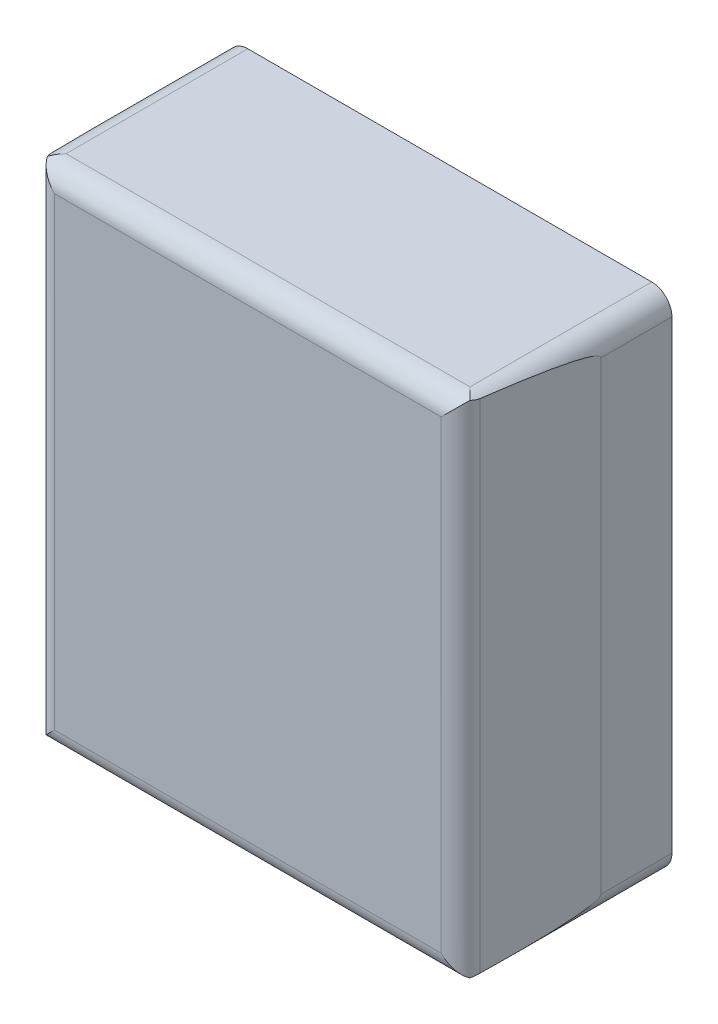
ISO-10303-21;
HEADER;
FILE_DESCRIPTION(('STEP AP214'),'2;1');
FILE_NAME('part.step','',(''),(''),'','','');
FILE_SCHEMA(('AUTOMOTIVE_DESIGN { 1 0 10303 214 1 1 1 1 }'));
ENDSEC;
DATA;
#1=APPLICATION_CONTEXT('core data for automotive mechanical design processes');
#2=APPLICATION_PROTOCOL_DEFINITION('international standard','automotive_design',2000,#1);
#3=PRODUCT_CONTEXT('',#1,'mechanical');
#4=PRODUCT('Part','Part','',(#3));
#5=PRODUCT_RELATED_PRODUCT_CATEGORY('part','',(#4));
#6=PRODUCT_DEFINITION_FORMATION('','',#4);
#7=PRODUCT_DEFINITION_CONTEXT('part definition',#1,'design');
#8=PRODUCT_DEFINITION('design','',#6,#7);
#9=PRODUCT_DEFINITION_SHAPE('','',#8);
#10=(LENGTH_UNIT() NAMED_UNIT(*) SI_UNIT(.MILLI.,.METRE.));
#11=(NAMED_UNIT(*) PLANE_ANGLE_UNIT() SI_UNIT($,.RADIAN.));
#12=(NAMED_UNIT(*) SI_UNIT($,.STERADIAN.) SOLID_ANGLE_UNIT());
#13=UNCERTAINTY_MEASURE_WITH_UNIT(LENGTH_MEASURE(1.E-05),#10,'distance_accuracy_value','');
#14=(GEOMETRIC_REPRESENTATION_CONTEXT(3) GLOBAL_UNCERTAINTY_ASSIGNED_CONTEXT((#13)) GLOBAL_UNIT_ASSIGNED_CONTEXT((#10,
#11,#12)) REPRESENTATION_CONTEXT('',''));
#15=CARTESIAN_POINT('',(0.,0.,0.));
#16=DIRECTION('',(0.,0.,1.));
#17=DIRECTION('',(1.,0.,0.));
#18=AXIS2_PLACEMENT_3D('',#15,#16,#17);
#19=CARTESIAN_POINT('',(0.,0.625,0.78));
#20=DIRECTION('',(0.,1.,0.));
#21=DIRECTION('',(1.,0.,0.));
#22=AXIS2_PLACEMENT_3D('',#19,#20,#21);
#23=PLANE('',#22);
#24=DIRECTION('',(1.,0.,0.));
#25=VECTOR('',#24,1.);
#26=CARTESIAN_POINT('',(0.,0.625,0.28));
#27=LINE('',#26,#25);
#28=CARTESIAN_POINT('',(-0.5,0.625,0.28));
#29=VERTEX_POINT('',#28);
#30=CARTESIAN_POINT('',(0.5,0.625,0.28));
#31=VERTEX_POINT('',#30);
#32=EDGE_CURVE('E41',#29,#31,#27,.T.);
#33=ORIENTED_EDGE('',*,*,#32,.F.);
#34=DIRECTION('',(0.,0.,1.));
#35=VECTOR('',#34,1.);
#36=CARTESIAN_POINT('',(-0.5,0.625,0.455));
#37=LINE('',#36,#35);
#38=CARTESIAN_POINT('',(-0.5,0.625,0.73));
#39=VERTEX_POINT('',#38);
#40=EDGE_CURVE('E11',#29,#39,#37,.T.);
#41=ORIENTED_EDGE('',*,*,#40,.T.);
#42=DIRECTION('',(1.,0.,0.));
#43=VECTOR('',#42,1.);
#44=CARTESIAN_POINT('',(0.,0.625,0.73));
#45=LINE('',#44,#43);
#46=CARTESIAN_POINT('',(0.5,0.625,0.73));
#47=VERTEX_POINT('',#46);
#48=EDGE_CURVE('E28',#39,#47,#45,.T.);
#49=ORIENTED_EDGE('',*,*,#48,.T.);
#50=DIRECTION('',(0.,0.,-1.));
#51=VECTOR('',#50,1.);
#52=CARTESIAN_POINT('',(0.5,0.625,0.78));
#53=LINE('',#52,#51);
#54=EDGE_CURVE('E221',#47,#31,#53,.T.);
#55=ORIENTED_EDGE('',*,*,#54,.T.);
#56=EDGE_LOOP('',(#33,#41,#49,#55));
#57=FACE_BOUND('',#56,.T.);
#58=ADVANCED_FACE('F17',(#57),#23,.T.);
#59=CARTESIAN_POINT('',(-0.55,0.,0.78));
#60=DIRECTION('',(1.,0.,0.));
#61=DIRECTION('',(0.,1.,0.));
#62=AXIS2_PLACEMENT_3D('',#59,#60,#61);
#63=PLANE('',#62);
#64=DIRECTION('',(0.,1.,0.));
#65=VECTOR('',#64,1.);
#66=CARTESIAN_POINT('',(-0.55,0.625,0.455));
#67=LINE('',#66,#65);
#68=CARTESIAN_POINT('',(-0.55,-0.575,0.455));
#69=VERTEX_POINT('',#68);
#70=CARTESIAN_POINT('',(-0.55,0.575,0.455));
#71=VERTEX_POINT('',#70);
#72=EDGE_CURVE('E218',#69,#71,#67,.T.);
#73=ORIENTED_EDGE('',*,*,#72,.T.);
#74=DIRECTION('',(0.,0.,-1.));
#75=VECTOR('',#74,1.);
#76=CARTESIAN_POINT('',(-0.55,0.575,0.28));
#77=LINE('',#76,#75);
#78=CARTESIAN_POINT('',(-0.55,0.575,0.28));
#79=VERTEX_POINT('',#78);
#80=EDGE_CURVE('E222',#71,#79,#77,.T.);
#81=ORIENTED_EDGE('',*,*,#80,.T.);
#82=DIRECTION('',(0.,-1.,0.));
#83=VECTOR('',#82,1.);
#84=CARTESIAN_POINT('',(-0.55,0.,0.28));
#85=LINE('',#84,#83);
#86=CARTESIAN_POINT('',(-0.55,-0.575,0.28));
#87=VERTEX_POINT('',#86);
#88=EDGE_CURVE('E231',#79,#87,#85,.T.);
#89=ORIENTED_EDGE('',*,*,#88,.T.);
#90=DIRECTION('',(0.,0.,1.));
#91=VECTOR('',#90,1.);
#92=CARTESIAN_POINT('',(-0.55,-0.575,0.78));
#93=LINE('',#92,#91);
#94=EDGE_CURVE('E238',#87,#69,#93,.T.);
#95=ORIENTED_EDGE('',*,*,#94,.T.);
#96=EDGE_LOOP('',(#73,#81,#89,#95));
#97=FACE_BOUND('',#96,.T.);
#98=ADVANCED_FACE('F599',(#97),#63,.F.);
#99=CARTESIAN_POINT('',(0.,-0.625,0.78));
#100=DIRECTION('',(0.,1.,0.));
#101=DIRECTION('',(1.,0.,0.));
#102=AXIS2_PLACEMENT_3D('',#99,#100,#101);
#103=PLANE('',#102);
#104=DIRECTION('',(1.,0.,0.));
#105=VECTOR('',#104,1.);
#106=CARTESIAN_POINT('',(0.,-0.625,0.28));
#107=LINE('',#106,#105);
#108=CARTESIAN_POINT('',(-0.5,-0.625,0.28));
#109=VERTEX_POINT('',#108);
#110=CARTESIAN_POINT('',(0.5,-0.625,0.28));
#111=VERTEX_POINT('',#110);
#112=EDGE_CURVE('E341',#109,#111,#107,.T.);
#113=ORIENTED_EDGE('',*,*,#112,.T.);
#114=DIRECTION('',(0.,0.,1.));
#115=VECTOR('',#114,1.);
#116=CARTESIAN_POINT('',(0.5,-0.625,0.455));
#117=LINE('',#116,#115);
#118=CARTESIAN_POINT('',(0.5,-0.625,0.73));
#119=VERTEX_POINT('',#118);
#120=EDGE_CURVE('E337',#111,#119,#117,.T.);
#121=ORIENTED_EDGE('',*,*,#120,.T.);
#122=DIRECTION('',(-1.,0.,0.));
#123=VECTOR('',#122,1.);
#124=CARTESIAN_POINT('',(-0.525,-0.625,0.73));
#125=LINE('',#124,#123);
#126=CARTESIAN_POINT('',(-0.5,-0.625,0.73));
#127=VERTEX_POINT('',#126);
#128=EDGE_CURVE('E213',#119,#127,#125,.T.);
#129=ORIENTED_EDGE('',*,*,#128,.T.);
#130=DIRECTION('',(0.,0.,-1.));
#131=VECTOR('',#130,1.);
#132=CARTESIAN_POINT('',(-0.5,-0.625,0.78));
#133=LINE('',#132,#131);
#134=EDGE_CURVE('E60',#127,#109,#133,.T.);
#135=ORIENTED_EDGE('',*,*,#134,.T.);
#136=EDGE_LOOP('',(#113,#121,#129,#135));
#137=FACE_BOUND('',#136,.T.);
#138=ADVANCED_FACE('F371',(#137),#103,.F.);
#139=CARTESIAN_POINT('',(0.55,0.,0.78));
#140=DIRECTION('',(1.,0.,0.));
#141=DIRECTION('',(0.,1.,0.));
#142=AXIS2_PLACEMENT_3D('',#139,#140,#141);
#143=PLANE('',#142);
#144=DIRECTION('',(0.,-1.,0.));
#145=VECTOR('',#144,1.);
#146=CARTESIAN_POINT('',(0.55,0.,0.28));
#147=LINE('',#146,#145);
#148=CARTESIAN_POINT('',(0.55,0.575,0.28));
#149=VERTEX_POINT('',#148);
#150=CARTESIAN_POINT('',(0.55,-0.575,0.28));
#151=VERTEX_POINT('',#150);
#152=EDGE_CURVE('E251',#149,#151,#147,.T.);
#153=ORIENTED_EDGE('',*,*,#152,.F.);
#154=DIRECTION('',(0.,0.,1.));
#155=VECTOR('',#154,1.);
#156=CARTESIAN_POINT('',(0.55,0.575,0.78));
#157=LINE('',#156,#155);
#158=CARTESIAN_POINT('',(0.55,0.575,0.455));
#159=VERTEX_POINT('',#158);
#160=EDGE_CURVE('E296',#149,#159,#157,.T.);
#161=ORIENTED_EDGE('',*,*,#160,.T.);
#162=DIRECTION('',(0.,-1.,0.));
#163=VECTOR('',#162,1.);
#164=CARTESIAN_POINT('',(0.55,0.,0.455));
#165=LINE('',#164,#163);
#166=CARTESIAN_POINT('',(0.55,-0.575,0.455));
#167=VERTEX_POINT('',#166);
#168=EDGE_CURVE('E292',#159,#167,#165,.T.);
#169=ORIENTED_EDGE('',*,*,#168,.T.);
#170=DIRECTION('',(0.,0.,-1.));
#171=VECTOR('',#170,1.);
#172=CARTESIAN_POINT('',(0.55,-0.575,0.28));
#173=LINE('',#172,#171);
#174=EDGE_CURVE('E244',#167,#151,#173,.T.);
#175=ORIENTED_EDGE('',*,*,#174,.T.);
#176=EDGE_LOOP('',(#153,#161,#169,#175));
#177=FACE_BOUND('',#176,.T.);
#178=ADVANCED_FACE('F374',(#177),#143,.T.);
#179=CARTESIAN_POINT('',(0.,0.,0.78));
#180=DIRECTION('',(0.,0.,1.));
#181=DIRECTION('',(1.,0.,0.));
#182=AXIS2_PLACEMENT_3D('',#179,#180,#181);
#183=PLANE('',#182);
#184=DIRECTION('',(1.,0.,0.));
#185=VECTOR('',#184,1.);
#186=CARTESIAN_POINT('',(0.525,-0.575,0.78));
#187=LINE('',#186,#185);
#188=CARTESIAN_POINT('',(-0.478698443036903,-0.575,0.78));
#189=VERTEX_POINT('',#188);
#190=CARTESIAN_POINT('',(0.478698443036903,-0.575,0.78));
#191=VERTEX_POINT('',#190);
#192=EDGE_CURVE('E241',#189,#191,#187,.T.);
#193=ORIENTED_EDGE('',*,*,#192,.T.);
#194=DIRECTION('',(0.,1.,0.));
#195=VECTOR('',#194,1.);
#196=CARTESIAN_POINT('',(0.478698443036903,0.,0.78));
#197=LINE('',#196,#195);
#198=CARTESIAN_POINT('',(0.478698443036903,0.575,0.78));
#199=VERTEX_POINT('',#198);
#200=EDGE_CURVE('E191',#191,#199,#197,.T.);
#201=ORIENTED_EDGE('',*,*,#200,.T.);
#202=DIRECTION('',(-1.,0.,0.));
#203=VECTOR('',#202,1.);
#204=CARTESIAN_POINT('',(0.,0.575,0.78));
#205=LINE('',#204,#203);
#206=CARTESIAN_POINT('',(-0.478698443036903,0.575,0.78));
#207=VERTEX_POINT('',#206);
#208=EDGE_CURVE('E169',#199,#207,#205,.T.);
#209=ORIENTED_EDGE('',*,*,#208,.T.);
#210=DIRECTION('',(0.,-1.,0.));
#211=VECTOR('',#210,1.);
#212=CARTESIAN_POINT('',(-0.478698443036903,0.,0.78));
#213=LINE('',#212,#211);
#214=EDGE_CURVE('E178',#207,#189,#213,.T.);
#215=ORIENTED_EDGE('',*,*,#214,.T.);
#216=EDGE_LOOP('',(#193,#201,#209,#215));
#217=FACE_BOUND('',#216,.T.);
#218=ADVANCED_FACE('F190',(#217),#183,.T.);
#219=CARTESIAN_POINT('',(0.,0.,0.28));
#220=DIRECTION('',(0.,0.,1.));
#221=DIRECTION('',(1.,0.,0.));
#222=AXIS2_PLACEMENT_3D('',#219,#220,#221);
#223=PLANE('',#222);
#224=ORIENTED_EDGE('',*,*,#88,.F.);
#225=CARTESIAN_POINT('',(-0.5,0.575,0.28));
#226=DIRECTION('',(0.,0.,-1.));
#227=DIRECTION('',(1.,0.,0.));
#228=AXIS2_PLACEMENT_3D('',#225,#226,#227);
#229=CIRCLE('',#228,0.05);
#230=EDGE_CURVE('E188',#79,#29,#229,.T.);
#231=ORIENTED_EDGE('',*,*,#230,.T.);
#232=ORIENTED_EDGE('',*,*,#32,.T.);
#233=CARTESIAN_POINT('',(0.5,0.575,0.28));
#234=DIRECTION('',(0.,0.,-1.));
#235=DIRECTION('',(1.,0.,0.));
#236=AXIS2_PLACEMENT_3D('',#233,#234,#235);
#237=CIRCLE('',#236,0.05);
#238=EDGE_CURVE('E247',#31,#149,#237,.T.);
#239=ORIENTED_EDGE('',*,*,#238,.T.);
#240=ORIENTED_EDGE('',*,*,#152,.T.);
#241=CARTESIAN_POINT('',(0.5,-0.575,0.28));
#242=DIRECTION('',(0.,0.,-1.));
#243=DIRECTION('',(1.,0.,0.));
#244=AXIS2_PLACEMENT_3D('',#241,#242,#243);
#245=CIRCLE('',#244,0.05);
#246=EDGE_CURVE('E281',#151,#111,#245,.T.);
#247=ORIENTED_EDGE('',*,*,#246,.T.);
#248=ORIENTED_EDGE('',*,*,#112,.F.);
#249=CARTESIAN_POINT('',(-0.5,-0.575,0.28));
#250=DIRECTION('',(0.,0.,-1.));
#251=DIRECTION('',(1.,0.,0.));
#252=AXIS2_PLACEMENT_3D('',#249,#250,#251);
#253=CIRCLE('',#252,0.05);
#254=EDGE_CURVE('E285',#109,#87,#253,.T.);
#255=ORIENTED_EDGE('',*,*,#254,.T.);
#256=EDGE_LOOP('',(#224,#231,#232,#239,#240,#247,#248,#255));
#257=FACE_BOUND('',#256,.T.);
#258=ADVANCED_FACE('F19',(#257),#223,.F.);
#259=CARTESIAN_POINT('',(0.55,0.,0.455));
#260=DIRECTION('',(-0.997054485501582,0.,-0.0766964988847369));
#261=DIRECTION('',(-0.0766964988847369,0.,0.997054485501582));
#262=AXIS2_PLACEMENT_3D('',#259,#260,#261);
#263=PLANE('',#262);
#264=ORIENTED_EDGE('',*,*,#168,.F.);
#265=CARTESIAN_POINT('',(0.5,0.575,1.105));
#266=DIRECTION('',(0.997054485501582,0.,0.0766964988847369));
#267=DIRECTION('',(0.0766964988847369,0.,-0.997054485501582));
#268=AXIS2_PLACEMENT_3D('',#265,#266,#267);
#269=ELLIPSE('',#268,0.651920240520266,0.05);
#270=CARTESIAN_POINT('',(0.528551167311982,0.616046691037442,0.733834824944237));
#271=VERTEX_POINT('',#270);
#272=EDGE_CURVE('E217',#159,#271,#269,.T.);
#273=ORIENTED_EDGE('',*,*,#272,.T.);
#274=DIRECTION('',(0.,-1.,0.));
#275=VECTOR('',#274,1.);
#276=CARTESIAN_POINT('',(0.528551167311982,0.,0.733834824944237));
#277=LINE('',#276,#275);
#278=CARTESIAN_POINT('',(0.528551167311982,-0.616046691037442,0.733834824944237));
#279=VERTEX_POINT('',#278);
#280=EDGE_CURVE('E215',#271,#279,#277,.T.);
#281=ORIENTED_EDGE('',*,*,#280,.T.);
#282=CARTESIAN_POINT('',(0.5,-0.575,1.105));
#283=DIRECTION('',(0.997054485501582,0.,0.0766964988847369));
#284=DIRECTION('',(-0.0766964988847369,0.,0.997054485501582));
#285=AXIS2_PLACEMENT_3D('',#282,#283,#284);
#286=ELLIPSE('',#285,0.651920240520266,0.05);
#287=EDGE_CURVE('E21',#279,#167,#286,.T.);
#288=ORIENTED_EDGE('',*,*,#287,.T.);
#289=EDGE_LOOP('',(#264,#273,#281,#288));
#290=FACE_BOUND('',#289,.T.);
#291=ADVANCED_FACE('F376',(#290),#263,.F.);
#292=CARTESIAN_POINT('',(-0.525,0.,0.78));
#293=DIRECTION('',(-0.997054485501582,0.,0.0766964988847369));
#294=DIRECTION('',(0.,1.,0.));
#295=AXIS2_PLACEMENT_3D('',#292,#293,#294);
#296=PLANE('',#295);
#297=DIRECTION('',(0.,1.,0.));
#298=VECTOR('',#297,1.);
#299=CARTESIAN_POINT('',(-0.528551167311982,0.,0.733834824944237));
#300=LINE('',#299,#298);
#301=CARTESIAN_POINT('',(-0.528551167311982,-0.616046691037442,0.733834824944237));
#302=VERTEX_POINT('',#301);
#303=CARTESIAN_POINT('',(-0.528551167311982,0.616046691037442,0.733834824944237));
#304=VERTEX_POINT('',#303);
#305=EDGE_CURVE('E263',#302,#304,#300,.T.);
#306=ORIENTED_EDGE('',*,*,#305,.T.);
#307=CARTESIAN_POINT('',(-0.5,0.575,1.105));
#308=DIRECTION('',(-0.997054485501582,0.,0.0766964988847369));
#309=DIRECTION('',(0.0766964988847369,0.,0.997054485501582));
#310=AXIS2_PLACEMENT_3D('',#307,#308,#309);
#311=ELLIPSE('',#310,0.651920240520266,0.05);
#312=EDGE_CURVE('E116',#304,#71,#311,.T.);
#313=ORIENTED_EDGE('',*,*,#312,.T.);
#314=ORIENTED_EDGE('',*,*,#72,.F.);
#315=CARTESIAN_POINT('',(-0.5,-0.575,1.105));
#316=DIRECTION('',(-0.997054485501582,0.,0.0766964988847369));
#317=DIRECTION('',(-0.0766964988847369,0.,-0.997054485501582));
#318=AXIS2_PLACEMENT_3D('',#315,#316,#317);
#319=ELLIPSE('',#318,0.651920240520266,0.05);
#320=EDGE_CURVE('E286',#69,#302,#319,.T.);
#321=ORIENTED_EDGE('',*,*,#320,.T.);
#322=EDGE_LOOP('',(#306,#313,#314,#321));
#323=FACE_BOUND('',#322,.T.);
#324=ADVANCED_FACE('F554',(#323),#296,.T.);
#325=CARTESIAN_POINT('',(0.5,-0.575,0.78));
#326=DIRECTION('',(0.,0.,1.));
#327=DIRECTION('',(1.,0.,0.));
#328=AXIS2_PLACEMENT_3D('',#325,#326,#327);
#329=CYLINDRICAL_SURFACE('',#328,0.05);
#330=ORIENTED_EDGE('',*,*,#174,.F.);
#331=ORIENTED_EDGE('',*,*,#287,.F.);
#332=CARTESIAN_POINT('',(0.523062140670981,-0.619363697632996,0.753062140669193));
#333=CARTESIAN_POINT('',(0.524467937011033,-0.618632904784816,0.750357867693648));
#334=CARTESIAN_POINT('',(0.525630183581545,-0.617944301054909,0.747521290077286));
#335=CARTESIAN_POINT('',(0.526526983743498,-0.617383005243519,0.744578351459246));
#336=CARTESIAN_POINT('',(0.527577998696991,-0.616725188356178,0.741129341717725));
#337=CARTESIAN_POINT('',(0.528266596469969,-0.616244632199496,0.737534245890401));
#338=CARTESIAN_POINT('',(0.528551167311982,-0.616046691037442,0.733834824944237));
#339=(BOUNDED_CURVE() B_SPLINE_CURVE(3,(#332,#333,#334,#335,#336,#337,#338),.UNSPECIFIED.,.F.,
.F.) B_SPLINE_CURVE_WITH_KNOTS((4,3,4),(-2.03045321076262E-05,-1.09560536317317E-05,0.),
.UNSPECIFIED.) CURVE() GEOMETRIC_REPRESENTATION_ITEM() RATIONAL_B_SPLINE_CURVE((1.,1.,1.,1.,1.,
1.,1.)) REPRESENTATION_ITEM(''));
#340=CARTESIAN_POINT('',(0.523062140672151,-0.619363697635246,0.753062140669193));
#341=VERTEX_POINT('',#340);
#342=EDGE_CURVE('E257',#341,#279,#339,.T.);
#343=ORIENTED_EDGE('',*,*,#342,.F.);
#344=CARTESIAN_POINT('',(0.5,-0.575,0.73));
#345=DIRECTION('',(-0.707106781186548,0.,0.707106781186548));
#346=DIRECTION('',(0.707106781186548,0.,0.707106781186548));
#347=AXIS2_PLACEMENT_3D('',#344,#345,#346);
#348=ELLIPSE('',#347,0.0707106781186548,0.05);
#349=EDGE_CURVE('E258',#119,#341,#348,.T.);
#350=ORIENTED_EDGE('',*,*,#349,.F.);
#351=ORIENTED_EDGE('',*,*,#120,.F.);
#352=ORIENTED_EDGE('',*,*,#246,.F.);
#353=EDGE_LOOP('',(#330,#331,#343,#350,#351,#352));
#354=FACE_BOUND('',#353,.T.);
#355=ADVANCED_FACE('F369',(#354),#329,.T.);
#356=CARTESIAN_POINT('',(0.5,0.575,0.78));
#357=DIRECTION('',(0.,0.,-1.));
#358=DIRECTION('',(-1.,0.,0.));
#359=AXIS2_PLACEMENT_3D('',#356,#357,#358);
#360=CYLINDRICAL_SURFACE('',#359,0.05);
#361=CARTESIAN_POINT('',(0.528551167310406,0.616046691038538,0.733834824944057));
#362=CARTESIAN_POINT('',(0.52833341727114,0.616198153133183,0.736665575454839));
#363=CARTESIAN_POINT('',(0.527879095117439,0.616513827377461,0.739435079499482));
#364=CARTESIAN_POINT('',(0.527206951623783,0.616949753078429,0.742125959352481));
#365=CARTESIAN_POINT('',(0.526252654856368,0.617568672239579,0.745946420265151));
#366=CARTESIAN_POINT('',(0.524857546319619,0.618430369262331,0.749608392186746));
#367=CARTESIAN_POINT('',(0.523062140670152,0.619363697633427,0.753062140670192));
#368=(BOUNDED_CURVE() B_SPLINE_CURVE(3,(#361,#362,#363,#364,#365,#366,#367),.UNSPECIFIED.,.F.,
.F.) B_SPLINE_CURVE_WITH_KNOTS((4,3,4),(-5.3205902606327E-05,-4.48197490935525E-05,
-3.2913245104718E-05),
.UNSPECIFIED.) CURVE() GEOMETRIC_REPRESENTATION_ITEM() RATIONAL_B_SPLINE_CURVE((1.,1.,1.,1.,1.,
1.,1.)) REPRESENTATION_ITEM(''));
#369=CARTESIAN_POINT('',(0.523062140670269,0.619363697633366,0.753062140670269));
#370=VERTEX_POINT('',#369);
#371=EDGE_CURVE('E252',#271,#370,#368,.T.);
#372=ORIENTED_EDGE('',*,*,#371,.F.);
#373=ORIENTED_EDGE('',*,*,#272,.F.);
#374=ORIENTED_EDGE('',*,*,#160,.F.);
#375=ORIENTED_EDGE('',*,*,#238,.F.);
#376=ORIENTED_EDGE('',*,*,#54,.F.);
#377=CARTESIAN_POINT('',(0.5,0.575,0.73));
#378=DIRECTION('',(-0.707106781186548,0.,0.707106781186548));
#379=DIRECTION('',(-0.707106781186548,0.,-0.707106781186548));
#380=AXIS2_PLACEMENT_3D('',#377,#378,#379);
#381=ELLIPSE('',#380,0.0707106781186548,0.05);
#382=EDGE_CURVE('E199',#370,#47,#381,.T.);
#383=ORIENTED_EDGE('',*,*,#382,.F.);
#384=EDGE_LOOP('',(#372,#373,#374,#375,#376,#383));
#385=FACE_BOUND('',#384,.T.);
#386=ADVANCED_FACE('F356',(#385),#360,.T.);
#387=CARTESIAN_POINT('',(0.478698443036903,0.,0.73));
#388=DIRECTION('',(0.,-1.,0.));
#389=DIRECTION('',(0.,0.,-1.));
#390=AXIS2_PLACEMENT_3D('',#387,#388,#389);
#391=CYLINDRICAL_SURFACE('',#390,0.05);
#392=CARTESIAN_POINT('',(0.478698443036903,0.575,0.73));
#393=DIRECTION('',(-0.707106781186548,0.707106781186548,0.));
#394=DIRECTION('',(-0.707106781186548,-0.707106781186548,0.));
#395=AXIS2_PLACEMENT_3D('',#392,#393,#394);
#396=ELLIPSE('',#395,0.0707106781186548,0.05);
#397=EDGE_CURVE('E208',#199,#370,#396,.T.);
#398=ORIENTED_EDGE('',*,*,#397,.F.);
#399=ORIENTED_EDGE('',*,*,#200,.F.);
#400=CARTESIAN_POINT('',(0.478698443036903,-0.575,0.73));
#401=DIRECTION('',(-0.707106781186548,-0.707106781186548,0.));
#402=DIRECTION('',(0.707106781186548,-0.707106781186548,0.));
#403=AXIS2_PLACEMENT_3D('',#400,#401,#402);
#404=ELLIPSE('',#403,0.0707106781186548,0.05);
#405=EDGE_CURVE('E266',#341,#191,#404,.T.);
#406=ORIENTED_EDGE('',*,*,#405,.F.);
#407=ORIENTED_EDGE('',*,*,#342,.T.);
#408=ORIENTED_EDGE('',*,*,#280,.F.);
#409=ORIENTED_EDGE('',*,*,#371,.T.);
#410=EDGE_LOOP('',(#398,#399,#406,#407,#408,#409));
#411=FACE_BOUND('',#410,.T.);
#412=ADVANCED_FACE('F351',(#411),#391,.T.);
#413=CARTESIAN_POINT('',(0.,-0.575,0.73));
#414=DIRECTION('',(-1.,0.,0.));
#415=DIRECTION('',(0.,0.,1.));
#416=AXIS2_PLACEMENT_3D('',#413,#414,#415);
#417=CYLINDRICAL_SURFACE('',#416,0.05);
#418=CARTESIAN_POINT('',(-0.5,-0.575,0.73));
#419=DIRECTION('',(-0.707106781186548,0.,-0.707106781186548));
#420=DIRECTION('',(0.707106781186548,0.,-0.707106781186548));
#421=AXIS2_PLACEMENT_3D('',#418,#419,#420);
#422=ELLIPSE('',#421,0.0707106781186548,0.05);
#423=CARTESIAN_POINT('',(-0.523062140670269,-0.619363697633366,0.753062140670269));
#424=VERTEX_POINT('',#423);
#425=EDGE_CURVE('E270',#127,#424,#422,.T.);
#426=ORIENTED_EDGE('',*,*,#425,.F.);
#427=ORIENTED_EDGE('',*,*,#128,.F.);
#428=ORIENTED_EDGE('',*,*,#349,.T.);
#429=ORIENTED_EDGE('',*,*,#405,.T.);
#430=ORIENTED_EDGE('',*,*,#192,.F.);
#431=CARTESIAN_POINT('',(-0.478698443036903,-0.575,0.73));
#432=DIRECTION('',(-0.707106781186548,0.707106781186548,0.));
#433=DIRECTION('',(-0.707106781186548,-0.707106781186548,0.));
#434=AXIS2_PLACEMENT_3D('',#431,#432,#433);
#435=ELLIPSE('',#434,0.0707106781186548,0.05);
#436=EDGE_CURVE('E183',#424,#189,#435,.T.);
#437=ORIENTED_EDGE('',*,*,#436,.F.);
#438=EDGE_LOOP('',(#426,#427,#428,#429,#430,#437));
#439=FACE_BOUND('',#438,.T.);
#440=ADVANCED_FACE('F367',(#439),#417,.T.);
#441=CARTESIAN_POINT('',(-0.5,-0.575,0.78));
#442=DIRECTION('',(0.,0.,-1.));
#443=DIRECTION('',(-1.,0.,0.));
#444=AXIS2_PLACEMENT_3D('',#441,#442,#443);
#445=CYLINDRICAL_SURFACE('',#444,0.05);
#446=ORIENTED_EDGE('',*,*,#134,.F.);
#447=ORIENTED_EDGE('',*,*,#425,.T.);
#448=CARTESIAN_POINT('',(-0.528551167310406,-0.616046691038538,0.733834824944057));
#449=CARTESIAN_POINT('',(-0.528333417271139,-0.616198153133183,0.736665575454839));
#450=CARTESIAN_POINT('',(-0.527879095117439,-0.616513827377461,0.739435079499483));
#451=CARTESIAN_POINT('',(-0.527206951623783,-0.616949753078429,0.742125959352482));
#452=CARTESIAN_POINT('',(-0.526252654856368,-0.61756867223958,0.745946420265151));
#453=CARTESIAN_POINT('',(-0.524857546319619,-0.618430369262331,0.749608392186746));
#454=CARTESIAN_POINT('',(-0.523062140670152,-0.619363697633427,0.753062140670192));
#455=(BOUNDED_CURVE() B_SPLINE_CURVE(3,(#448,#449,#450,#451,#452,#453,#454),.UNSPECIFIED.,.F.,
.F.) B_SPLINE_CURVE_WITH_KNOTS((4,3,4),(-5.3205902606327E-05,-4.48197490935521E-05,
-3.2913245104718E-05),
.UNSPECIFIED.) CURVE() GEOMETRIC_REPRESENTATION_ITEM() RATIONAL_B_SPLINE_CURVE((1.,1.,1.,1.,1.,
1.,1.)) REPRESENTATION_ITEM(''));
#456=EDGE_CURVE('E200',#302,#424,#455,.T.);
#457=ORIENTED_EDGE('',*,*,#456,.F.);
#458=ORIENTED_EDGE('',*,*,#320,.F.);
#459=ORIENTED_EDGE('',*,*,#94,.F.);
#460=ORIENTED_EDGE('',*,*,#254,.F.);
#461=EDGE_LOOP('',(#446,#447,#457,#458,#459,#460));
#462=FACE_BOUND('',#461,.T.);
#463=ADVANCED_FACE('F364',(#462),#445,.T.);
#464=CARTESIAN_POINT('',(0.,0.575,0.73));
#465=DIRECTION('',(1.,0.,0.));
#466=DIRECTION('',(0.,0.,-1.));
#467=AXIS2_PLACEMENT_3D('',#464,#465,#466);
#468=CYLINDRICAL_SURFACE('',#467,0.05);
#469=CARTESIAN_POINT('',(-0.478698443036903,0.575,0.73));
#470=DIRECTION('',(-0.707106781186548,-0.707106781186548,0.));
#471=DIRECTION('',(0.707106781186548,-0.707106781186548,0.));
#472=AXIS2_PLACEMENT_3D('',#469,#470,#471);
#473=ELLIPSE('',#472,0.0707106781186548,0.05);
#474=CARTESIAN_POINT('',(-0.523062140672151,0.619363697635246,0.753062140669193));
#475=VERTEX_POINT('',#474);
#476=EDGE_CURVE('E181',#207,#475,#473,.T.);
#477=ORIENTED_EDGE('',*,*,#476,.F.);
#478=ORIENTED_EDGE('',*,*,#208,.F.);
#479=ORIENTED_EDGE('',*,*,#397,.T.);
#480=ORIENTED_EDGE('',*,*,#382,.T.);
#481=ORIENTED_EDGE('',*,*,#48,.F.);
#482=CARTESIAN_POINT('',(-0.5,0.575,0.73));
#483=DIRECTION('',(-0.707106781186548,0.,-0.707106781186548));
#484=DIRECTION('',(-0.707106781186548,0.,0.707106781186548));
#485=AXIS2_PLACEMENT_3D('',#482,#483,#484);
#486=ELLIPSE('',#485,0.0707106781186548,0.05);
#487=EDGE_CURVE('E197',#475,#39,#486,.T.);
#488=ORIENTED_EDGE('',*,*,#487,.F.);
#489=EDGE_LOOP('',(#477,#478,#479,#480,#481,#488));
#490=FACE_BOUND('',#489,.T.);
#491=ADVANCED_FACE('F195',(#490),#468,.T.);
#492=CARTESIAN_POINT('',(-0.478698443036903,0.,0.73));
#493=DIRECTION('',(0.,-1.,0.));
#494=DIRECTION('',(0.,0.,-1.));
#495=AXIS2_PLACEMENT_3D('',#492,#493,#494);
#496=CYLINDRICAL_SURFACE('',#495,0.05);
#497=ORIENTED_EDGE('',*,*,#214,.F.);
#498=ORIENTED_EDGE('',*,*,#476,.T.);
#499=CARTESIAN_POINT('',(-0.528551167311982,0.616046691037442,0.733834824944237));
#500=CARTESIAN_POINT('',(-0.528266596469975,0.616244632199492,0.737534245890335));
#501=CARTESIAN_POINT('',(-0.527577998697056,0.616725188356132,0.741129341717483));
#502=CARTESIAN_POINT('',(-0.52652698374364,0.617383005243431,0.744578351458847));
#503=CARTESIAN_POINT('',(-0.525630183581678,0.61794430105483,0.747521290077));
#504=CARTESIAN_POINT('',(-0.524467937011125,0.618632904784768,0.75035786769347));
#505=CARTESIAN_POINT('',(-0.523062140670981,0.619363697632996,0.753062140669193));
#506=(BOUNDED_CURVE() B_SPLINE_CURVE(3,(#499,#500,#501,#502,#503,#504,#505),.UNSPECIFIED.,.F.,
.F.) B_SPLINE_CURVE_WITH_KNOTS((4,3,4),(0.,1.09560536307158E-05,2.03045321072176E-05),
.UNSPECIFIED.) CURVE() GEOMETRIC_REPRESENTATION_ITEM() RATIONAL_B_SPLINE_CURVE((1.,1.,1.,1.,1.,
1.,1.)) REPRESENTATION_ITEM(''));
#507=EDGE_CURVE('E271',#304,#475,#506,.T.);
#508=ORIENTED_EDGE('',*,*,#507,.F.);
#509=ORIENTED_EDGE('',*,*,#305,.F.);
#510=ORIENTED_EDGE('',*,*,#456,.T.);
#511=ORIENTED_EDGE('',*,*,#436,.T.);
#512=EDGE_LOOP('',(#497,#498,#508,#509,#510,#511));
#513=FACE_BOUND('',#512,.T.);
#514=ADVANCED_FACE('F179',(#513),#496,.T.);
#515=CARTESIAN_POINT('',(-0.5,0.575,0.78));
#516=DIRECTION('',(0.,0.,1.));
#517=DIRECTION('',(1.,0.,0.));
#518=AXIS2_PLACEMENT_3D('',#515,#516,#517);
#519=CYLINDRICAL_SURFACE('',#518,0.05);
#520=ORIENTED_EDGE('',*,*,#487,.T.);
#521=ORIENTED_EDGE('',*,*,#40,.F.);
#522=ORIENTED_EDGE('',*,*,#230,.F.);
#523=ORIENTED_EDGE('',*,*,#80,.F.);
#524=ORIENTED_EDGE('',*,*,#312,.F.);
#525=ORIENTED_EDGE('',*,*,#507,.T.);
#526=EDGE_LOOP('',(#520,#521,#522,#523,#524,#525));
#527=FACE_BOUND('',#526,.T.);
#528=ADVANCED_FACE('F359',(#527),#519,.T.);
#529=CLOSED_SHELL('',(#58,#98,#138,#178,#218,#258,#291,#324,#355,#386,#412,#440,#463,#491,#514,#528));
#530=MANIFOLD_SOLID_BREP('B1',#529);
#531=ADVANCED_BREP_SHAPE_REPRESENTATION('',(#18,#530),#14);
#532=SHAPE_DEFINITION_REPRESENTATION(#9,#531);
ENDSEC;
END-ISO-10303-21;
